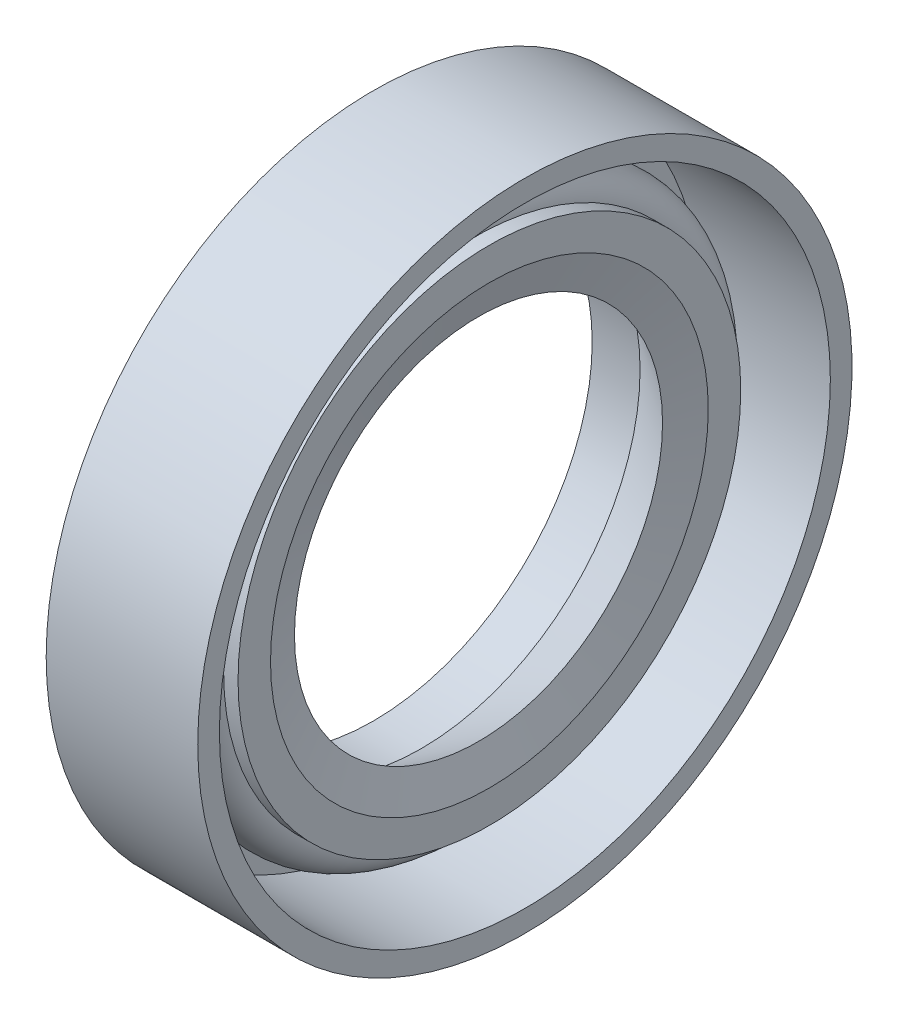
ISO-10303-21;
HEADER;
FILE_DESCRIPTION(('STEP AP214'),'2;1');
FILE_NAME('part.step','',(''),(''),'','','');
FILE_SCHEMA(('AUTOMOTIVE_DESIGN { 1 0 10303 214 1 1 1 1 }'));
ENDSEC;
DATA;
#1=APPLICATION_CONTEXT('core data for automotive mechanical design processes');
#2=APPLICATION_PROTOCOL_DEFINITION('international standard','automotive_design',2000,#1);
#3=PRODUCT_CONTEXT('',#1,'mechanical');
#4=PRODUCT('Part','Part','',(#3));
#5=PRODUCT_RELATED_PRODUCT_CATEGORY('part','',(#4));
#6=PRODUCT_DEFINITION_FORMATION('','',#4);
#7=PRODUCT_DEFINITION_CONTEXT('part definition',#1,'design');
#8=PRODUCT_DEFINITION('design','',#6,#7);
#9=PRODUCT_DEFINITION_SHAPE('','',#8);
#10=(LENGTH_UNIT() NAMED_UNIT(*) SI_UNIT(.MILLI.,.METRE.));
#11=(NAMED_UNIT(*) PLANE_ANGLE_UNIT() SI_UNIT($,.RADIAN.));
#12=(NAMED_UNIT(*) SI_UNIT($,.STERADIAN.) SOLID_ANGLE_UNIT());
#13=UNCERTAINTY_MEASURE_WITH_UNIT(LENGTH_MEASURE(1.E-05),#10,'distance_accuracy_value','');
#14=(GEOMETRIC_REPRESENTATION_CONTEXT(3) GLOBAL_UNCERTAINTY_ASSIGNED_CONTEXT((#13)) GLOBAL_UNIT_ASSIGNED_CONTEXT((#10,
#11,#12)) REPRESENTATION_CONTEXT('',''));
#15=CARTESIAN_POINT('',(0.,0.,0.));
#16=DIRECTION('',(0.,0.,1.));
#17=DIRECTION('',(1.,0.,0.));
#18=AXIS2_PLACEMENT_3D('',#15,#16,#17);
#19=CARTESIAN_POINT('',(0.,10.10872807987,0.));
#20=DIRECTION('',(1.,0.,0.));
#21=DIRECTION('',(0.,0.,-1.));
#22=AXIS2_PLACEMENT_3D('',#19,#20,#21);
#23=PLANE('',#22);
#24=CARTESIAN_POINT('',(0.,0.,0.));
#25=DIRECTION('',(-1.,0.,0.));
#26=DIRECTION('',(0.,0.,1.));
#27=AXIS2_PLACEMENT_3D('',#24,#25,#26);
#28=CIRCLE('',#27,10.10872807987);
#29=CARTESIAN_POINT('',(0.,0.,10.10872807987));
#30=VERTEX_POINT('',#29);
#31=EDGE_CURVE('E77',#30,#30,#28,.T.);
#32=ORIENTED_EDGE('',*,*,#31,.F.);
#33=EDGE_LOOP('',(#32));
#34=FACE_BOUND('',#33,.T.);
#35=CARTESIAN_POINT('',(0.,0.,0.));
#36=DIRECTION('',(-1.,0.,0.));
#37=DIRECTION('',(0.,0.,1.));
#38=AXIS2_PLACEMENT_3D('',#35,#36,#37);
#39=CIRCLE('',#38,15.10872807987);
#40=CARTESIAN_POINT('',(0.,0.,15.10872807987));
#41=VERTEX_POINT('',#40);
#42=EDGE_CURVE('E10',#41,#41,#39,.T.);
#43=ORIENTED_EDGE('',*,*,#42,.T.);
#44=EDGE_LOOP('',(#43));
#45=FACE_BOUND('',#44,.T.);
#46=ADVANCED_FACE('F37',(#34,#45),#23,.F.);
#47=CARTESIAN_POINT('',(0.,0.,0.));
#48=DIRECTION('',(-1.,0.,0.));
#49=DIRECTION('',(0.,0.,1.));
#50=AXIS2_PLACEMENT_3D('',#47,#48,#49);
#51=CYLINDRICAL_SURFACE('',#50,15.10872807987);
#52=ORIENTED_EDGE('',*,*,#42,.F.);
#53=EDGE_LOOP('',(#52));
#54=FACE_BOUND('',#53,.T.);
#55=CARTESIAN_POINT('',(7.,0.,0.));
#56=DIRECTION('',(-1.,0.,0.));
#57=DIRECTION('',(0.,0.,1.));
#58=AXIS2_PLACEMENT_3D('',#55,#56,#57);
#59=CIRCLE('',#58,15.10872807987);
#60=CARTESIAN_POINT('',(7.,0.,15.10872807987));
#61=VERTEX_POINT('',#60);
#62=EDGE_CURVE('E43',#61,#61,#59,.T.);
#63=ORIENTED_EDGE('',*,*,#62,.T.);
#64=EDGE_LOOP('',(#63));
#65=FACE_BOUND('',#64,.T.);
#66=ADVANCED_FACE('F84',(#54,#65),#51,.T.);
#67=CARTESIAN_POINT('',(7.,15.10872807987,0.));
#68=DIRECTION('',(-1.,0.,0.));
#69=DIRECTION('',(0.,0.,1.));
#70=AXIS2_PLACEMENT_3D('',#67,#68,#69);
#71=PLANE('',#70);
#72=ORIENTED_EDGE('',*,*,#62,.F.);
#73=EDGE_LOOP('',(#72));
#74=FACE_BOUND('',#73,.T.);
#75=CARTESIAN_POINT('',(7.,0.,0.));
#76=DIRECTION('',(-1.,0.,0.));
#77=DIRECTION('',(0.,0.,1.));
#78=AXIS2_PLACEMENT_3D('',#75,#76,#77);
#79=CIRCLE('',#78,14.10872807987);
#80=CARTESIAN_POINT('',(7.,0.,14.10872807987));
#81=VERTEX_POINT('',#80);
#82=EDGE_CURVE('E47',#81,#81,#79,.T.);
#83=ORIENTED_EDGE('',*,*,#82,.T.);
#84=EDGE_LOOP('',(#83));
#85=FACE_BOUND('',#84,.T.);
#86=ADVANCED_FACE('F88',(#74,#85),#71,.F.);
#87=CARTESIAN_POINT('',(0.,0.,0.));
#88=DIRECTION('',(-1.,0.,0.));
#89=DIRECTION('',(0.,0.,1.));
#90=AXIS2_PLACEMENT_3D('',#87,#88,#89);
#91=CYLINDRICAL_SURFACE('',#90,14.10872807987);
#92=ORIENTED_EDGE('',*,*,#82,.F.);
#93=EDGE_LOOP('',(#92));
#94=FACE_BOUND('',#93,.T.);
#95=CARTESIAN_POINT('',(1.,0.,0.));
#96=DIRECTION('',(-1.,0.,0.));
#97=DIRECTION('',(0.,0.,1.));
#98=AXIS2_PLACEMENT_3D('',#95,#96,#97);
#99=CIRCLE('',#98,14.10872807987);
#100=CARTESIAN_POINT('',(1.,0.,14.10872807987));
#101=VERTEX_POINT('',#100);
#102=EDGE_CURVE('E51',#101,#101,#99,.T.);
#103=ORIENTED_EDGE('',*,*,#102,.T.);
#104=EDGE_LOOP('',(#103));
#105=FACE_BOUND('',#104,.T.);
#106=ADVANCED_FACE('F93',(#94,#105),#91,.F.);
#107=CARTESIAN_POINT('',(1.,14.10872807987,0.));
#108=DIRECTION('',(-1.,0.,0.));
#109=DIRECTION('',(0.,0.,1.));
#110=AXIS2_PLACEMENT_3D('',#107,#108,#109);
#111=PLANE('',#110);
#112=ORIENTED_EDGE('',*,*,#102,.F.);
#113=EDGE_LOOP('',(#112));
#114=FACE_BOUND('',#113,.T.);
#115=CARTESIAN_POINT('',(1.,0.,0.));
#116=DIRECTION('',(-1.,0.,0.));
#117=DIRECTION('',(0.,0.,1.));
#118=AXIS2_PLACEMENT_3D('',#115,#116,#117);
#119=CIRCLE('',#118,11.60872807987);
#120=CARTESIAN_POINT('',(1.,0.,11.60872807987));
#121=VERTEX_POINT('',#120);
#122=EDGE_CURVE('E56',#121,#121,#119,.T.);
#123=ORIENTED_EDGE('',*,*,#122,.T.);
#124=EDGE_LOOP('',(#123));
#125=FACE_BOUND('',#124,.T.);
#126=ADVANCED_FACE('F99',(#114,#125),#111,.F.);
#127=CARTESIAN_POINT('',(0.,0.,0.));
#128=DIRECTION('',(-1.,0.,0.));
#129=DIRECTION('',(0.,0.,1.));
#130=AXIS2_PLACEMENT_3D('',#127,#128,#129);
#131=CYLINDRICAL_SURFACE('',#130,11.60872807987);
#132=ORIENTED_EDGE('',*,*,#122,.F.);
#133=EDGE_LOOP('',(#132));
#134=FACE_BOUND('',#133,.T.);
#135=CARTESIAN_POINT('',(2.21224326418386,0.,0.));
#136=DIRECTION('',(-1.,0.,0.));
#137=DIRECTION('',(0.,0.,1.));
#138=AXIS2_PLACEMENT_3D('',#135,#136,#137);
#139=CIRCLE('',#138,11.60872807987);
#140=CARTESIAN_POINT('',(2.21224326418386,0.,11.60872807987));
#141=VERTEX_POINT('',#140);
#142=EDGE_CURVE('E59',#141,#141,#139,.T.);
#143=ORIENTED_EDGE('',*,*,#142,.T.);
#144=EDGE_LOOP('',(#143));
#145=FACE_BOUND('',#144,.T.);
#146=ADVANCED_FACE('F103',(#134,#145),#131,.T.);
#147=CARTESIAN_POINT('',(3.4539297476924,0.,0.));
#148=DIRECTION('',(-1.,0.,0.));
#149=DIRECTION('',(0.,0.,1.));
#150=AXIS2_PLACEMENT_3D('',#147,#148,#149);
#151=TOROIDAL_SURFACE('',#150,11.60872807987,1.24168648350854);
#152=ORIENTED_EDGE('',*,*,#142,.F.);
#153=EDGE_LOOP('',(#152));
#154=FACE_BOUND('',#153,.T.);
#155=CARTESIAN_POINT('',(4.69561623120093,0.,0.));
#156=DIRECTION('',(-1.,0.,0.));
#157=DIRECTION('',(0.,0.,1.));
#158=AXIS2_PLACEMENT_3D('',#155,#156,#157);
#159=CIRCLE('',#158,11.60872807987);
#160=CARTESIAN_POINT('',(4.69561623120093,0.,11.60872807987));
#161=VERTEX_POINT('',#160);
#162=EDGE_CURVE('E62',#161,#161,#159,.T.);
#163=ORIENTED_EDGE('',*,*,#162,.T.);
#164=EDGE_LOOP('',(#163));
#165=FACE_BOUND('',#164,.T.);
#166=ADVANCED_FACE('F107',(#154,#165),#151,.T.);
#167=CARTESIAN_POINT('',(0.,0.,0.));
#168=DIRECTION('',(-1.,0.,0.));
#169=DIRECTION('',(0.,0.,1.));
#170=AXIS2_PLACEMENT_3D('',#167,#168,#169);
#171=CYLINDRICAL_SURFACE('',#170,11.60872807987);
#172=ORIENTED_EDGE('',*,*,#162,.F.);
#173=EDGE_LOOP('',(#172));
#174=FACE_BOUND('',#173,.T.);
#175=CARTESIAN_POINT('',(5.36079714550509,0.,0.));
#176=DIRECTION('',(-1.,0.,0.));
#177=DIRECTION('',(0.,0.,1.));
#178=AXIS2_PLACEMENT_3D('',#175,#176,#177);
#179=CIRCLE('',#178,11.60872807987);
#180=CARTESIAN_POINT('',(5.36079714550509,0.,11.60872807987));
#181=VERTEX_POINT('',#180);
#182=EDGE_CURVE('E65',#181,#181,#179,.T.);
#183=ORIENTED_EDGE('',*,*,#182,.T.);
#184=EDGE_LOOP('',(#183));
#185=FACE_BOUND('',#184,.T.);
#186=ADVANCED_FACE('F111',(#174,#185),#171,.T.);
#187=CARTESIAN_POINT('',(5.36079714550509,11.60872807987,0.));
#188=DIRECTION('',(-1.,0.,0.));
#189=DIRECTION('',(0.,0.,1.));
#190=AXIS2_PLACEMENT_3D('',#187,#188,#189);
#191=PLANE('',#190);
#192=ORIENTED_EDGE('',*,*,#182,.F.);
#193=EDGE_LOOP('',(#192));
#194=FACE_BOUND('',#193,.T.);
#195=CARTESIAN_POINT('',(5.36079714550509,0.,0.));
#196=DIRECTION('',(-1.,0.,0.));
#197=DIRECTION('',(0.,0.,1.));
#198=AXIS2_PLACEMENT_3D('',#195,#196,#197);
#199=CIRCLE('',#198,10.10872807987);
#200=CARTESIAN_POINT('',(5.36079714550509,0.,10.10872807987));
#201=VERTEX_POINT('',#200);
#202=EDGE_CURVE('E68',#201,#201,#199,.T.);
#203=ORIENTED_EDGE('',*,*,#202,.T.);
#204=EDGE_LOOP('',(#203));
#205=FACE_BOUND('',#204,.T.);
#206=ADVANCED_FACE('F115',(#194,#205),#191,.F.);
#207=CARTESIAN_POINT('',(4.8581923063065,0.,0.));
#208=DIRECTION('',(1.,0.,0.));
#209=DIRECTION('',(0.,0.,-1.));
#210=AXIS2_PLACEMENT_3D('',#207,#208,#209);
#211=CONICAL_SURFACE('',#210,8.5,1.26798093758519);
#212=ORIENTED_EDGE('',*,*,#202,.F.);
#213=EDGE_LOOP('',(#212));
#214=FACE_BOUND('',#213,.T.);
#215=CARTESIAN_POINT('',(4.8581923063065,0.,0.));
#216=DIRECTION('',(-1.,0.,0.));
#217=DIRECTION('',(0.,0.,1.));
#218=AXIS2_PLACEMENT_3D('',#215,#216,#217);
#219=CIRCLE('',#218,8.5);
#220=CARTESIAN_POINT('',(4.8581923063065,0.,8.5));
#221=VERTEX_POINT('',#220);
#222=EDGE_CURVE('E71',#221,#221,#219,.T.);
#223=ORIENTED_EDGE('',*,*,#222,.T.);
#224=EDGE_LOOP('',(#223));
#225=FACE_BOUND('',#224,.T.);
#226=ADVANCED_FACE('F119',(#214,#225),#211,.F.);
#227=CARTESIAN_POINT('',(2.21224326418386,0.,0.));
#228=DIRECTION('',(-1.,0.,0.));
#229=DIRECTION('',(0.,0.,1.));
#230=AXIS2_PLACEMENT_3D('',#227,#228,#229);
#231=CONICAL_SURFACE('',#230,10.10872807987,0.546278631624849);
#232=ORIENTED_EDGE('',*,*,#222,.F.);
#233=EDGE_LOOP('',(#232));
#234=FACE_BOUND('',#233,.T.);
#235=CARTESIAN_POINT('',(2.21224326418386,0.,0.));
#236=DIRECTION('',(-1.,0.,0.));
#237=DIRECTION('',(0.,0.,1.));
#238=AXIS2_PLACEMENT_3D('',#235,#236,#237);
#239=CIRCLE('',#238,10.10872807987);
#240=CARTESIAN_POINT('',(2.21224326418386,0.,10.10872807987));
#241=VERTEX_POINT('',#240);
#242=EDGE_CURVE('E74',#241,#241,#239,.T.);
#243=ORIENTED_EDGE('',*,*,#242,.T.);
#244=EDGE_LOOP('',(#243));
#245=FACE_BOUND('',#244,.T.);
#246=ADVANCED_FACE('F123',(#234,#245),#231,.F.);
#247=CARTESIAN_POINT('',(0.,0.,0.));
#248=DIRECTION('',(-1.,0.,0.));
#249=DIRECTION('',(0.,0.,1.));
#250=AXIS2_PLACEMENT_3D('',#247,#248,#249);
#251=CYLINDRICAL_SURFACE('',#250,10.10872807987);
#252=ORIENTED_EDGE('',*,*,#242,.F.);
#253=EDGE_LOOP('',(#252));
#254=FACE_BOUND('',#253,.T.);
#255=ORIENTED_EDGE('',*,*,#31,.T.);
#256=EDGE_LOOP('',(#255));
#257=FACE_BOUND('',#256,.T.);
#258=ADVANCED_FACE('F81',(#254,#257),#251,.F.);
#259=CLOSED_SHELL('',(#46,#66,#86,#106,#126,#146,#166,#186,#206,#226,#246,#258));
#260=MANIFOLD_SOLID_BREP('B2',#259);
#261=ADVANCED_BREP_SHAPE_REPRESENTATION('',(#18,#260),#14);
#262=SHAPE_DEFINITION_REPRESENTATION(#9,#261);
ENDSEC;
END-ISO-10303-21;
